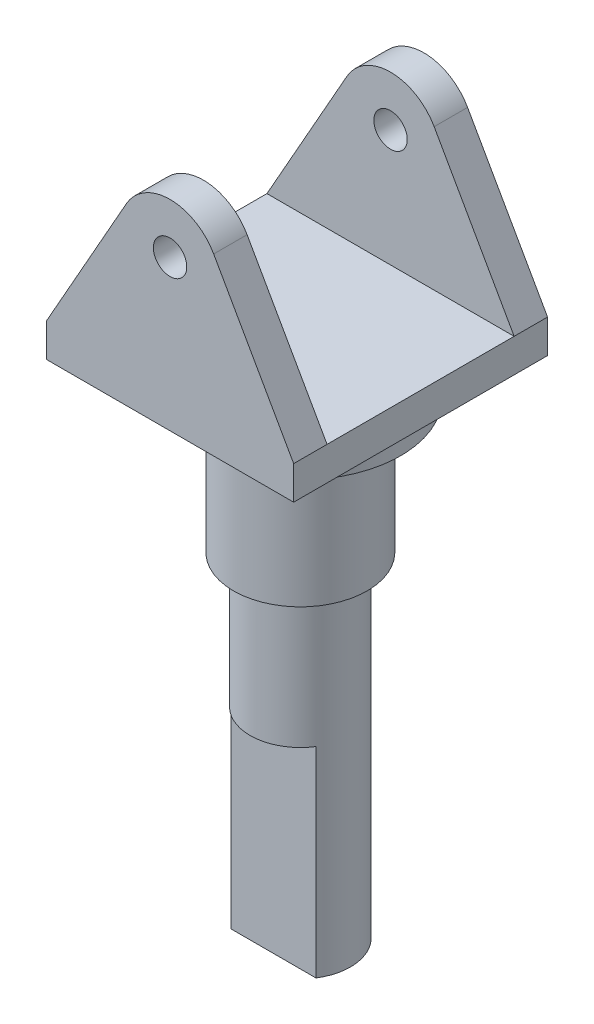
ISO-10303-21;
HEADER;
FILE_DESCRIPTION(('STEP AP214'),'2;1');
FILE_NAME('part.step','',(''),(''),'','','');
FILE_SCHEMA(('AUTOMOTIVE_DESIGN { 1 0 10303 214 1 1 1 1 }'));
ENDSEC;
DATA;
#1=APPLICATION_CONTEXT('core data for automotive mechanical design processes');
#2=APPLICATION_PROTOCOL_DEFINITION('international standard','automotive_design',2000,#1);
#3=PRODUCT_CONTEXT('',#1,'mechanical');
#4=PRODUCT('Part','Part','',(#3));
#5=PRODUCT_RELATED_PRODUCT_CATEGORY('part','',(#4));
#6=PRODUCT_DEFINITION_FORMATION('','',#4);
#7=PRODUCT_DEFINITION_CONTEXT('part definition',#1,'design');
#8=PRODUCT_DEFINITION('design','',#6,#7);
#9=PRODUCT_DEFINITION_SHAPE('','',#8);
#10=(LENGTH_UNIT() NAMED_UNIT(*) SI_UNIT(.MILLI.,.METRE.));
#11=(NAMED_UNIT(*) PLANE_ANGLE_UNIT() SI_UNIT($,.RADIAN.));
#12=(NAMED_UNIT(*) SI_UNIT($,.STERADIAN.) SOLID_ANGLE_UNIT());
#13=UNCERTAINTY_MEASURE_WITH_UNIT(LENGTH_MEASURE(1.E-05),#10,'distance_accuracy_value','');
#14=(GEOMETRIC_REPRESENTATION_CONTEXT(3) GLOBAL_UNCERTAINTY_ASSIGNED_CONTEXT((#13)) GLOBAL_UNIT_ASSIGNED_CONTEXT((#10,
#11,#12)) REPRESENTATION_CONTEXT('',''));
#15=CARTESIAN_POINT('',(0.,0.,0.));
#16=DIRECTION('',(0.,0.,1.));
#17=DIRECTION('',(1.,0.,0.));
#18=AXIS2_PLACEMENT_3D('',#15,#16,#17);
#19=CARTESIAN_POINT('',(38.,-10.,-18.));
#20=DIRECTION('',(0.,1.,0.));
#21=DIRECTION('',(0.,0.,1.));
#22=AXIS2_PLACEMENT_3D('',#19,#20,#21);
#23=PLANE('',#22);
#24=CARTESIAN_POINT('',(38.,-10.,-38.));
#25=DIRECTION('',(0.,1.,0.));
#26=DIRECTION('',(0.,0.,1.));
#27=AXIS2_PLACEMENT_3D('',#24,#25,#26);
#28=CIRCLE('',#27,20.);
#29=CARTESIAN_POINT('',(38.,-10.,-18.));
#30=VERTEX_POINT('',#29);
#31=EDGE_CURVE('E196',#30,#30,#28,.T.);
#32=ORIENTED_EDGE('',*,*,#31,.T.);
#33=EDGE_LOOP('',(#32));
#34=FACE_BOUND('',#33,.T.);
#35=DIRECTION('',(1.,0.,0.));
#36=VECTOR('',#35,1.);
#37=CARTESIAN_POINT('',(0.,-10.,-62.));
#38=LINE('',#37,#36);
#39=CARTESIAN_POINT('',(20.,-10.,-62.));
#40=VERTEX_POINT('',#39);
#41=CARTESIAN_POINT('',(56.,-10.,-62.));
#42=VERTEX_POINT('',#41);
#43=EDGE_CURVE('E174',#40,#42,#38,.T.);
#44=ORIENTED_EDGE('',*,*,#43,.T.);
#45=CARTESIAN_POINT('',(38.,-10.,-38.));
#46=DIRECTION('',(0.,1.,0.));
#47=DIRECTION('',(0.,0.,1.));
#48=AXIS2_PLACEMENT_3D('',#45,#46,#47);
#49=CIRCLE('',#48,30.);
#50=CARTESIAN_POINT('',(56.,-10.,-14.));
#51=VERTEX_POINT('',#50);
#52=EDGE_CURVE('E193',#51,#42,#49,.T.);
#53=ORIENTED_EDGE('',*,*,#52,.F.);
#54=DIRECTION('',(1.,0.,0.));
#55=VECTOR('',#54,1.);
#56=CARTESIAN_POINT('',(0.,-10.,-14.));
#57=LINE('',#56,#55);
#58=CARTESIAN_POINT('',(20.,-10.,-14.));
#59=VERTEX_POINT('',#58);
#60=EDGE_CURVE('E168',#59,#51,#57,.T.);
#61=ORIENTED_EDGE('',*,*,#60,.F.);
#62=EDGE_CURVE('E192',#40,#59,#49,.T.);
#63=ORIENTED_EDGE('',*,*,#62,.F.);
#64=EDGE_LOOP('',(#44,#53,#61,#63));
#65=FACE_BOUND('',#64,.T.);
#66=ADVANCED_FACE('F36',(#34,#65),#23,.F.);
#67=CARTESIAN_POINT('',(38.,0.,-38.));
#68=DIRECTION('',(0.,1.,0.));
#69=DIRECTION('',(0.,0.,1.));
#70=AXIS2_PLACEMENT_3D('',#67,#68,#69);
#71=CYLINDRICAL_SURFACE('',#70,30.);
#72=DIRECTION('',(0.,-1.,0.));
#73=VECTOR('',#72,1.);
#74=CARTESIAN_POINT('',(20.,0.,-62.));
#75=LINE('',#74,#73);
#76=CARTESIAN_POINT('',(20.,0.,-62.));
#77=VERTEX_POINT('',#76);
#78=EDGE_CURVE('E173',#77,#40,#75,.T.);
#79=ORIENTED_EDGE('',*,*,#78,.T.);
#80=ORIENTED_EDGE('',*,*,#62,.T.);
#81=DIRECTION('',(0.,-1.,0.));
#82=VECTOR('',#81,1.);
#83=CARTESIAN_POINT('',(20.,0.,-14.));
#84=LINE('',#83,#82);
#85=CARTESIAN_POINT('',(20.,0.,-14.));
#86=VERTEX_POINT('',#85);
#87=EDGE_CURVE('E185',#86,#59,#84,.T.);
#88=ORIENTED_EDGE('',*,*,#87,.F.);
#89=CARTESIAN_POINT('',(38.,0.,-38.));
#90=DIRECTION('',(0.,1.,0.));
#91=DIRECTION('',(0.,0.,1.));
#92=AXIS2_PLACEMENT_3D('',#89,#90,#91);
#93=CIRCLE('',#92,30.);
#94=EDGE_CURVE('E180',#77,#86,#93,.T.);
#95=ORIENTED_EDGE('',*,*,#94,.F.);
#96=EDGE_LOOP('',(#79,#80,#88,#95));
#97=FACE_BOUND('',#96,.T.);
#98=ADVANCED_FACE('F313',(#97),#71,.T.);
#99=DIRECTION('',(0.,-1.,0.));
#100=VECTOR('',#99,1.);
#101=CARTESIAN_POINT('',(56.,0.,-62.));
#102=LINE('',#101,#100);
#103=CARTESIAN_POINT('',(56.,0.,-62.));
#104=VERTEX_POINT('',#103);
#105=EDGE_CURVE('E178',#104,#42,#102,.T.);
#106=ORIENTED_EDGE('',*,*,#105,.F.);
#107=CARTESIAN_POINT('',(56.,0.,-14.));
#108=VERTEX_POINT('',#107);
#109=EDGE_CURVE('E190',#108,#104,#93,.T.);
#110=ORIENTED_EDGE('',*,*,#109,.F.);
#111=DIRECTION('',(0.,-1.,0.));
#112=VECTOR('',#111,1.);
#113=CARTESIAN_POINT('',(56.,0.,-14.));
#114=LINE('',#113,#112);
#115=EDGE_CURVE('E177',#108,#51,#114,.T.);
#116=ORIENTED_EDGE('',*,*,#115,.T.);
#117=ORIENTED_EDGE('',*,*,#52,.T.);
#118=EDGE_LOOP('',(#106,#110,#116,#117));
#119=FACE_BOUND('',#118,.T.);
#120=ADVANCED_FACE('F319',(#119),#71,.T.);
#121=CARTESIAN_POINT('',(0.,10.,-76.));
#122=DIRECTION('',(-0.870675826256482,0.491857302042566,0.));
#123=DIRECTION('',(-0.491857302042566,-0.870675826256482,0.));
#124=AXIS2_PLACEMENT_3D('',#121,#122,#123);
#125=PLANE('',#124);
#126=DIRECTION('',(0.,0.,1.));
#127=VECTOR('',#126,1.);
#128=CARTESIAN_POINT('',(23.9398626061528,52.3778595306385,-76.));
#129=LINE('',#128,#127);
#130=CARTESIAN_POINT('',(23.9398626061528,52.3778595306385,-9.99999999999999));
#131=VERTEX_POINT('',#130);
#132=CARTESIAN_POINT('',(23.9398626061528,52.3778595306385,0.));
#133=VERTEX_POINT('',#132);
#134=EDGE_CURVE('E282',#131,#133,#129,.T.);
#135=ORIENTED_EDGE('',*,*,#134,.F.);
#136=DIRECTION('',(-0.491857302042566,-0.870675826256482,0.));
#137=VECTOR('',#136,1.);
#138=CARTESIAN_POINT('',(0.,9.99999999999999,-9.99999999999999));
#139=LINE('',#138,#137);
#140=CARTESIAN_POINT('',(0.,10.,-10.));
#141=VERTEX_POINT('',#140);
#142=EDGE_CURVE('E230',#131,#141,#139,.T.);
#143=ORIENTED_EDGE('',*,*,#142,.T.);
#144=DIRECTION('',(0.,0.,1.));
#145=VECTOR('',#144,1.);
#146=CARTESIAN_POINT('',(0.,10.,-76.));
#147=LINE('',#146,#145);
#148=CARTESIAN_POINT('',(0.,10.,0.));
#149=VERTEX_POINT('',#148);
#150=EDGE_CURVE('E278',#141,#149,#147,.T.);
#151=ORIENTED_EDGE('',*,*,#150,.T.);
#152=DIRECTION('',(-0.491857302042566,-0.870675826256482,0.));
#153=VECTOR('',#152,1.);
#154=CARTESIAN_POINT('',(0.,10.,0.));
#155=LINE('',#154,#153);
#156=EDGE_CURVE('E271',#133,#149,#155,.T.);
#157=ORIENTED_EDGE('',*,*,#156,.F.);
#158=EDGE_LOOP('',(#135,#143,#151,#157));
#159=FACE_BOUND('',#158,.T.);
#160=ADVANCED_FACE('F395',(#159),#125,.T.);
#161=CARTESIAN_POINT('',(0.,10.,-76.));
#162=VERTEX_POINT('',#161);
#163=CARTESIAN_POINT('',(0.,10.,-66.));
#164=VERTEX_POINT('',#163);
#165=EDGE_CURVE('E45',#162,#164,#147,.T.);
#166=ORIENTED_EDGE('',*,*,#165,.T.);
#167=DIRECTION('',(0.491857302042566,0.870675826256482,0.));
#168=VECTOR('',#167,1.);
#169=CARTESIAN_POINT('',(0.,10.,-66.));
#170=LINE('',#169,#168);
#171=CARTESIAN_POINT('',(23.9398626061528,52.3778595306385,-66.));
#172=VERTEX_POINT('',#171);
#173=EDGE_CURVE('E221',#164,#172,#170,.T.);
#174=ORIENTED_EDGE('',*,*,#173,.T.);
#175=CARTESIAN_POINT('',(23.9398626061528,52.3778595306385,-76.));
#176=VERTEX_POINT('',#175);
#177=EDGE_CURVE('E279',#176,#172,#129,.T.);
#178=ORIENTED_EDGE('',*,*,#177,.F.);
#179=DIRECTION('',(-0.491857302042566,-0.870675826256482,0.));
#180=VECTOR('',#179,1.);
#181=CARTESIAN_POINT('',(0.,10.,-76.));
#182=LINE('',#181,#180);
#183=EDGE_CURVE('E253',#176,#162,#182,.T.);
#184=ORIENTED_EDGE('',*,*,#183,.T.);
#185=EDGE_LOOP('',(#166,#174,#178,#184));
#186=FACE_BOUND('',#185,.T.);
#187=ADVANCED_FACE('F390',(#186),#125,.T.);
#188=CARTESIAN_POINT('',(37.,45.,-76.));
#189=DIRECTION('',(0.,0.,1.));
#190=DIRECTION('',(1.,0.,0.));
#191=AXIS2_PLACEMENT_3D('',#188,#189,#190);
#192=CYLINDRICAL_SURFACE('',#191,15.);
#193=DIRECTION('',(0.,0.,1.));
#194=VECTOR('',#193,1.);
#195=CARTESIAN_POINT('',(50.0600995598342,52.3779265032405,-76.));
#196=LINE('',#195,#194);
#197=CARTESIAN_POINT('',(50.0600995598342,52.3779265032405,-9.99999999999999));
#198=VERTEX_POINT('',#197);
#199=CARTESIAN_POINT('',(50.0600995598342,52.3779265032405,0.));
#200=VERTEX_POINT('',#199);
#201=EDGE_CURVE('E286',#198,#200,#196,.T.);
#202=ORIENTED_EDGE('',*,*,#201,.F.);
#203=CARTESIAN_POINT('',(37.,45.,-9.99999999999999));
#204=DIRECTION('',(0.,0.,-1.));
#205=DIRECTION('',(0.,1.,0.));
#206=AXIS2_PLACEMENT_3D('',#203,#204,#205);
#207=CIRCLE('',#206,15.);
#208=EDGE_CURVE('E227',#198,#131,#207,.F.);
#209=ORIENTED_EDGE('',*,*,#208,.T.);
#210=ORIENTED_EDGE('',*,*,#134,.T.);
#211=CARTESIAN_POINT('',(37.,45.,0.));
#212=DIRECTION('',(0.,0.,1.));
#213=DIRECTION('',(1.,0.,0.));
#214=AXIS2_PLACEMENT_3D('',#211,#212,#213);
#215=CIRCLE('',#214,15.);
#216=EDGE_CURVE('E268',#200,#133,#215,.T.);
#217=ORIENTED_EDGE('',*,*,#216,.F.);
#218=EDGE_LOOP('',(#202,#209,#210,#217));
#219=FACE_BOUND('',#218,.T.);
#220=ADVANCED_FACE('F370',(#219),#192,.T.);
#221=ORIENTED_EDGE('',*,*,#177,.T.);
#222=CARTESIAN_POINT('',(37.,45.,-66.));
#223=DIRECTION('',(0.,0.,1.));
#224=DIRECTION('',(1.,0.,0.));
#225=AXIS2_PLACEMENT_3D('',#222,#223,#224);
#226=CIRCLE('',#225,15.);
#227=CARTESIAN_POINT('',(50.0600995598342,52.3779265032405,-66.));
#228=VERTEX_POINT('',#227);
#229=EDGE_CURVE('E218',#172,#228,#226,.F.);
#230=ORIENTED_EDGE('',*,*,#229,.T.);
#231=CARTESIAN_POINT('',(50.0600995598342,52.3779265032405,-76.));
#232=VERTEX_POINT('',#231);
#233=EDGE_CURVE('E283',#232,#228,#196,.T.);
#234=ORIENTED_EDGE('',*,*,#233,.F.);
#235=CARTESIAN_POINT('',(37.,45.,-76.));
#236=DIRECTION('',(0.,0.,1.));
#237=DIRECTION('',(1.,0.,0.));
#238=AXIS2_PLACEMENT_3D('',#235,#236,#237);
#239=CIRCLE('',#238,15.);
#240=EDGE_CURVE('E250',#232,#176,#239,.T.);
#241=ORIENTED_EDGE('',*,*,#240,.T.);
#242=EDGE_LOOP('',(#221,#230,#234,#241));
#243=FACE_BOUND('',#242,.T.);
#244=ADVANCED_FACE('F384',(#243),#192,.T.);
#245=CARTESIAN_POINT('',(74.0002866669992,10.,-76.));
#246=DIRECTION('',(0.870673303988948,0.491861766882698,0.));
#247=DIRECTION('',(-0.491861766882698,0.870673303988948,0.));
#248=AXIS2_PLACEMENT_3D('',#245,#246,#247);
#249=PLANE('',#248);
#250=DIRECTION('',(0.,0.,1.));
#251=VECTOR('',#250,1.);
#252=CARTESIAN_POINT('',(74.0002866669992,10.,-76.));
#253=LINE('',#252,#251);
#254=CARTESIAN_POINT('',(74.0002866669992,10.,-10.));
#255=VERTEX_POINT('',#254);
#256=CARTESIAN_POINT('',(74.0002866669992,10.,0.));
#257=VERTEX_POINT('',#256);
#258=EDGE_CURVE('E291',#255,#257,#253,.T.);
#259=ORIENTED_EDGE('',*,*,#258,.F.);
#260=DIRECTION('',(-0.491861766882698,0.870673303988948,0.));
#261=VECTOR('',#260,1.);
#262=CARTESIAN_POINT('',(74.0002866669992,9.99999999999999,-9.99999999999999));
#263=LINE('',#262,#261);
#264=EDGE_CURVE('E224',#255,#198,#263,.T.);
#265=ORIENTED_EDGE('',*,*,#264,.T.);
#266=ORIENTED_EDGE('',*,*,#201,.T.);
#267=DIRECTION('',(-0.491861766882698,0.870673303988948,0.));
#268=VECTOR('',#267,1.);
#269=CARTESIAN_POINT('',(74.0002866669992,10.,0.));
#270=LINE('',#269,#268);
#271=EDGE_CURVE('E265',#257,#200,#270,.T.);
#272=ORIENTED_EDGE('',*,*,#271,.F.);
#273=EDGE_LOOP('',(#259,#265,#266,#272));
#274=FACE_BOUND('',#273,.T.);
#275=ADVANCED_FACE('F366',(#274),#249,.T.);
#276=ORIENTED_EDGE('',*,*,#233,.T.);
#277=DIRECTION('',(0.491861766882698,-0.870673303988948,0.));
#278=VECTOR('',#277,1.);
#279=CARTESIAN_POINT('',(74.0002866669992,10.,-66.));
#280=LINE('',#279,#278);
#281=CARTESIAN_POINT('',(74.0002866669992,10.,-66.));
#282=VERTEX_POINT('',#281);
#283=EDGE_CURVE('E215',#228,#282,#280,.T.);
#284=ORIENTED_EDGE('',*,*,#283,.T.);
#285=CARTESIAN_POINT('',(74.0002866669992,10.,-76.));
#286=VERTEX_POINT('',#285);
#287=EDGE_CURVE('E287',#286,#282,#253,.T.);
#288=ORIENTED_EDGE('',*,*,#287,.F.);
#289=DIRECTION('',(-0.491861766882698,0.870673303988948,0.));
#290=VECTOR('',#289,1.);
#291=CARTESIAN_POINT('',(74.0002866669992,10.,-76.));
#292=LINE('',#291,#290);
#293=EDGE_CURVE('E247',#286,#232,#292,.T.);
#294=ORIENTED_EDGE('',*,*,#293,.T.);
#295=EDGE_LOOP('',(#276,#284,#288,#294));
#296=FACE_BOUND('',#295,.T.);
#297=ADVANCED_FACE('F307',(#296),#249,.T.);
#298=CARTESIAN_POINT('',(37.,45.,-76.));
#299=DIRECTION('',(0.,0.,1.));
#300=DIRECTION('',(1.,0.,0.));
#301=AXIS2_PLACEMENT_3D('',#298,#299,#300);
#302=CYLINDRICAL_SURFACE('',#301,5.00000000000001);
#303=CARTESIAN_POINT('',(37.,45.,0.));
#304=DIRECTION('',(0.,0.,1.));
#305=DIRECTION('',(1.,0.,0.));
#306=AXIS2_PLACEMENT_3D('',#303,#304,#305);
#307=CIRCLE('',#306,5.00000000000001);
#308=CARTESIAN_POINT('',(42.,45.,0.));
#309=VERTEX_POINT('',#308);
#310=EDGE_CURVE('E233',#309,#309,#307,.T.);
#311=ORIENTED_EDGE('',*,*,#310,.T.);
#312=EDGE_LOOP('',(#311));
#313=FACE_BOUND('',#312,.T.);
#314=CARTESIAN_POINT('',(37.,45.,-9.99999999999999));
#315=DIRECTION('',(0.,0.,-1.));
#316=DIRECTION('',(0.,1.,0.));
#317=AXIS2_PLACEMENT_3D('',#314,#315,#316);
#318=CIRCLE('',#317,5.00000000000001);
#319=CARTESIAN_POINT('',(37.,50.,-9.99999999999999));
#320=VERTEX_POINT('',#319);
#321=EDGE_CURVE('E40',#320,#320,#318,.F.);
#322=ORIENTED_EDGE('',*,*,#321,.F.);
#323=EDGE_LOOP('',(#322));
#324=FACE_BOUND('',#323,.T.);
#325=ADVANCED_FACE('F299',(#313,#324),#302,.F.);
#326=CARTESIAN_POINT('',(37.,45.,-76.));
#327=DIRECTION('',(0.,0.,1.));
#328=DIRECTION('',(1.,0.,0.));
#329=AXIS2_PLACEMENT_3D('',#326,#327,#328);
#330=CIRCLE('',#329,5.00000000000001);
#331=CARTESIAN_POINT('',(42.,45.,-76.));
#332=VERTEX_POINT('',#331);
#333=EDGE_CURVE('E234',#332,#332,#330,.T.);
#334=ORIENTED_EDGE('',*,*,#333,.F.);
#335=EDGE_LOOP('',(#334));
#336=FACE_BOUND('',#335,.T.);
#337=CARTESIAN_POINT('',(37.,45.,-66.));
#338=DIRECTION('',(0.,0.,1.));
#339=DIRECTION('',(1.,0.,0.));
#340=AXIS2_PLACEMENT_3D('',#337,#338,#339);
#341=CIRCLE('',#340,5.00000000000001);
#342=CARTESIAN_POINT('',(42.,45.,-66.));
#343=VERTEX_POINT('',#342);
#344=EDGE_CURVE('E214',#343,#343,#341,.F.);
#345=ORIENTED_EDGE('',*,*,#344,.F.);
#346=EDGE_LOOP('',(#345));
#347=FACE_BOUND('',#346,.T.);
#348=ADVANCED_FACE('F297',(#336,#347),#302,.F.);
#349=CARTESIAN_POINT('',(0.,0.,-76.));
#350=DIRECTION('',(0.,-1.,0.));
#351=DIRECTION('',(0.,0.,-1.));
#352=AXIS2_PLACEMENT_3D('',#349,#350,#351);
#353=PLANE('',#352);
#354=ORIENTED_EDGE('',*,*,#109,.T.);
#355=DIRECTION('',(1.,0.,0.));
#356=VECTOR('',#355,1.);
#357=CARTESIAN_POINT('',(0.,0.,-62.));
#358=LINE('',#357,#356);
#359=EDGE_CURVE('E60',#77,#104,#358,.T.);
#360=ORIENTED_EDGE('',*,*,#359,.F.);
#361=ORIENTED_EDGE('',*,*,#94,.T.);
#362=DIRECTION('',(1.,0.,0.));
#363=VECTOR('',#362,1.);
#364=CARTESIAN_POINT('',(0.,0.,-14.));
#365=LINE('',#364,#363);
#366=EDGE_CURVE('E183',#86,#108,#365,.T.);
#367=ORIENTED_EDGE('',*,*,#366,.T.);
#368=EDGE_LOOP('',(#354,#360,#361,#367));
#369=FACE_BOUND('',#368,.T.);
#370=DIRECTION('',(1.,0.,0.));
#371=VECTOR('',#370,1.);
#372=CARTESIAN_POINT('',(0.,0.,0.));
#373=LINE('',#372,#371);
#374=CARTESIAN_POINT('',(0.,0.,0.));
#375=VERTEX_POINT('',#374);
#376=CARTESIAN_POINT('',(74.0002866669992,0.,0.));
#377=VERTEX_POINT('',#376);
#378=EDGE_CURVE('E237',#375,#377,#373,.T.);
#379=ORIENTED_EDGE('',*,*,#378,.F.);
#380=DIRECTION('',(0.,0.,1.));
#381=VECTOR('',#380,1.);
#382=CARTESIAN_POINT('',(0.,0.,-76.));
#383=LINE('',#382,#381);
#384=CARTESIAN_POINT('',(0.,0.,-76.));
#385=VERTEX_POINT('',#384);
#386=EDGE_CURVE('E11',#385,#375,#383,.T.);
#387=ORIENTED_EDGE('',*,*,#386,.F.);
#388=DIRECTION('',(1.,0.,0.));
#389=VECTOR('',#388,1.);
#390=CARTESIAN_POINT('',(0.,0.,-76.));
#391=LINE('',#390,#389);
#392=CARTESIAN_POINT('',(74.0002866669992,0.,-76.));
#393=VERTEX_POINT('',#392);
#394=EDGE_CURVE('E240',#385,#393,#391,.T.);
#395=ORIENTED_EDGE('',*,*,#394,.T.);
#396=DIRECTION('',(0.,0.,1.));
#397=VECTOR('',#396,1.);
#398=CARTESIAN_POINT('',(74.0002866669992,0.,-76.));
#399=LINE('',#398,#397);
#400=EDGE_CURVE('E259',#393,#377,#399,.T.);
#401=ORIENTED_EDGE('',*,*,#400,.T.);
#402=EDGE_LOOP('',(#379,#387,#395,#401));
#403=FACE_BOUND('',#402,.T.);
#404=ADVANCED_FACE('F38',(#369,#403),#353,.T.);
#405=CARTESIAN_POINT('',(0.,0.,-76.));
#406=DIRECTION('',(-1.,0.,0.));
#407=DIRECTION('',(0.,0.,1.));
#408=AXIS2_PLACEMENT_3D('',#405,#406,#407);
#409=PLANE('',#408);
#410=DIRECTION('',(0.,-1.,0.));
#411=VECTOR('',#410,1.);
#412=CARTESIAN_POINT('',(0.,0.,0.));
#413=LINE('',#412,#411);
#414=EDGE_CURVE('E244',#149,#375,#413,.T.);
#415=ORIENTED_EDGE('',*,*,#414,.F.);
#416=ORIENTED_EDGE('',*,*,#150,.F.);
#417=DIRECTION('',(0.,0.,-1.));
#418=VECTOR('',#417,1.);
#419=CARTESIAN_POINT('',(0.,10.,-10.));
#420=LINE('',#419,#418);
#421=EDGE_CURVE('E206',#141,#164,#420,.T.);
#422=ORIENTED_EDGE('',*,*,#421,.T.);
#423=ORIENTED_EDGE('',*,*,#165,.F.);
#424=DIRECTION('',(0.,-1.,0.));
#425=VECTOR('',#424,1.);
#426=CARTESIAN_POINT('',(0.,0.,-76.));
#427=LINE('',#426,#425);
#428=EDGE_CURVE('E256',#162,#385,#427,.T.);
#429=ORIENTED_EDGE('',*,*,#428,.T.);
#430=ORIENTED_EDGE('',*,*,#386,.T.);
#431=EDGE_LOOP('',(#415,#416,#422,#423,#429,#430));
#432=FACE_BOUND('',#431,.T.);
#433=ADVANCED_FACE('F306',(#432),#409,.T.);
#434=CARTESIAN_POINT('',(74.0002866669992,0.,-76.));
#435=DIRECTION('',(1.,0.,0.));
#436=DIRECTION('',(0.,0.,-1.));
#437=AXIS2_PLACEMENT_3D('',#434,#435,#436);
#438=PLANE('',#437);
#439=DIRECTION('',(0.,1.,0.));
#440=VECTOR('',#439,1.);
#441=CARTESIAN_POINT('',(74.0002866669992,0.,0.));
#442=LINE('',#441,#440);
#443=EDGE_CURVE('E262',#377,#257,#442,.T.);
#444=ORIENTED_EDGE('',*,*,#443,.F.);
#445=ORIENTED_EDGE('',*,*,#400,.F.);
#446=DIRECTION('',(0.,1.,0.));
#447=VECTOR('',#446,1.);
#448=CARTESIAN_POINT('',(74.0002866669992,0.,-76.));
#449=LINE('',#448,#447);
#450=EDGE_CURVE('E243',#393,#286,#449,.T.);
#451=ORIENTED_EDGE('',*,*,#450,.T.);
#452=ORIENTED_EDGE('',*,*,#287,.T.);
#453=EDGE_CURVE('E290',#282,#255,#253,.T.);
#454=ORIENTED_EDGE('',*,*,#453,.T.);
#455=ORIENTED_EDGE('',*,*,#258,.T.);
#456=EDGE_LOOP('',(#444,#445,#451,#452,#454,#455));
#457=FACE_BOUND('',#456,.T.);
#458=ADVANCED_FACE('F376',(#457),#438,.T.);
#459=CARTESIAN_POINT('',(37.,45.,-76.));
#460=DIRECTION('',(0.,0.,1.));
#461=DIRECTION('',(1.,0.,0.));
#462=AXIS2_PLACEMENT_3D('',#459,#460,#461);
#463=PLANE('',#462);
#464=ORIENTED_EDGE('',*,*,#333,.T.);
#465=EDGE_LOOP('',(#464));
#466=FACE_BOUND('',#465,.T.);
#467=ORIENTED_EDGE('',*,*,#394,.F.);
#468=ORIENTED_EDGE('',*,*,#428,.F.);
#469=ORIENTED_EDGE('',*,*,#183,.F.);
#470=ORIENTED_EDGE('',*,*,#240,.F.);
#471=ORIENTED_EDGE('',*,*,#293,.F.);
#472=ORIENTED_EDGE('',*,*,#450,.F.);
#473=EDGE_LOOP('',(#467,#468,#469,#470,#471,#472));
#474=FACE_BOUND('',#473,.T.);
#475=ADVANCED_FACE('F353',(#466,#474),#463,.F.);
#476=CARTESIAN_POINT('',(37.,45.,0.));
#477=DIRECTION('',(0.,0.,1.));
#478=DIRECTION('',(1.,0.,0.));
#479=AXIS2_PLACEMENT_3D('',#476,#477,#478);
#480=PLANE('',#479);
#481=ORIENTED_EDGE('',*,*,#310,.F.);
#482=EDGE_LOOP('',(#481));
#483=FACE_BOUND('',#482,.T.);
#484=ORIENTED_EDGE('',*,*,#378,.T.);
#485=ORIENTED_EDGE('',*,*,#443,.T.);
#486=ORIENTED_EDGE('',*,*,#271,.T.);
#487=ORIENTED_EDGE('',*,*,#216,.T.);
#488=ORIENTED_EDGE('',*,*,#156,.T.);
#489=ORIENTED_EDGE('',*,*,#414,.T.);
#490=EDGE_LOOP('',(#484,#485,#486,#487,#488,#489));
#491=FACE_BOUND('',#490,.T.);
#492=ADVANCED_FACE('F348',(#483,#491),#480,.T.);
#493=CARTESIAN_POINT('',(128.,61.0486599011187,-9.99999999999999));
#494=DIRECTION('',(0.,0.,-1.));
#495=DIRECTION('',(0.,1.,0.));
#496=AXIS2_PLACEMENT_3D('',#493,#494,#495);
#497=PLANE('',#496);
#498=ORIENTED_EDGE('',*,*,#208,.F.);
#499=ORIENTED_EDGE('',*,*,#264,.F.);
#500=DIRECTION('',(-1.,0.,0.));
#501=VECTOR('',#500,1.);
#502=CARTESIAN_POINT('',(128.,10.,-10.));
#503=LINE('',#502,#501);
#504=EDGE_CURVE('E212',#255,#141,#503,.T.);
#505=ORIENTED_EDGE('',*,*,#504,.T.);
#506=ORIENTED_EDGE('',*,*,#142,.F.);
#507=EDGE_LOOP('',(#498,#499,#505,#506));
#508=FACE_BOUND('',#507,.T.);
#509=ORIENTED_EDGE('',*,*,#321,.T.);
#510=EDGE_LOOP('',(#509));
#511=FACE_BOUND('',#510,.T.);
#512=ADVANCED_FACE('F343',(#508,#511),#497,.T.);
#513=CARTESIAN_POINT('',(128.,10.,-66.));
#514=DIRECTION('',(0.,0.,1.));
#515=DIRECTION('',(1.,0.,0.));
#516=AXIS2_PLACEMENT_3D('',#513,#514,#515);
#517=PLANE('',#516);
#518=DIRECTION('',(-1.,0.,0.));
#519=VECTOR('',#518,1.);
#520=CARTESIAN_POINT('',(128.,10.,-66.));
#521=LINE('',#520,#519);
#522=EDGE_CURVE('E209',#282,#164,#521,.T.);
#523=ORIENTED_EDGE('',*,*,#522,.F.);
#524=ORIENTED_EDGE('',*,*,#283,.F.);
#525=ORIENTED_EDGE('',*,*,#229,.F.);
#526=ORIENTED_EDGE('',*,*,#173,.F.);
#527=EDGE_LOOP('',(#523,#524,#525,#526));
#528=FACE_BOUND('',#527,.T.);
#529=ORIENTED_EDGE('',*,*,#344,.T.);
#530=EDGE_LOOP('',(#529));
#531=FACE_BOUND('',#530,.T.);
#532=ADVANCED_FACE('F295',(#528,#531),#517,.T.);
#533=CARTESIAN_POINT('',(128.,10.,-10.));
#534=DIRECTION('',(0.,1.,0.));
#535=DIRECTION('',(0.,0.,1.));
#536=AXIS2_PLACEMENT_3D('',#533,#534,#535);
#537=PLANE('',#536);
#538=ORIENTED_EDGE('',*,*,#522,.T.);
#539=ORIENTED_EDGE('',*,*,#421,.F.);
#540=ORIENTED_EDGE('',*,*,#504,.F.);
#541=ORIENTED_EDGE('',*,*,#453,.F.);
#542=EDGE_LOOP('',(#538,#539,#540,#541));
#543=FACE_BOUND('',#542,.T.);
#544=ADVANCED_FACE('F339',(#543),#537,.T.);
#545=CARTESIAN_POINT('',(38.,-150.,-23.));
#546=DIRECTION('',(0.,1.,0.));
#547=DIRECTION('',(0.,0.,1.));
#548=AXIS2_PLACEMENT_3D('',#545,#546,#547);
#549=PLANE('',#548);
#550=CARTESIAN_POINT('',(38.,-150.,-38.));
#551=DIRECTION('',(0.,1.,0.));
#552=DIRECTION('',(0.,0.,1.));
#553=AXIS2_PLACEMENT_3D('',#550,#551,#552);
#554=CIRCLE('',#553,15.);
#555=CARTESIAN_POINT('',(50.6885775404495,-150.,-30.));
#556=VERTEX_POINT('',#555);
#557=CARTESIAN_POINT('',(25.3114224595505,-150.,-30.));
#558=VERTEX_POINT('',#557);
#559=EDGE_CURVE('E166',#556,#558,#554,.T.);
#560=ORIENTED_EDGE('',*,*,#559,.F.);
#561=DIRECTION('',(1.,0.,0.));
#562=VECTOR('',#561,1.);
#563=CARTESIAN_POINT('',(0.,-150.,-30.));
#564=LINE('',#563,#562);
#565=EDGE_CURVE('E154',#558,#556,#564,.T.);
#566=ORIENTED_EDGE('',*,*,#565,.F.);
#567=EDGE_LOOP('',(#560,#566));
#568=FACE_BOUND('',#567,.T.);
#569=ADVANCED_FACE('F336',(#568),#549,.F.);
#570=CARTESIAN_POINT('',(38.,0.,-38.));
#571=DIRECTION('',(0.,1.,0.));
#572=DIRECTION('',(0.,0.,1.));
#573=AXIS2_PLACEMENT_3D('',#570,#571,#572);
#574=CYLINDRICAL_SURFACE('',#573,15.);
#575=ORIENTED_EDGE('',*,*,#559,.T.);
#576=DIRECTION('',(0.,-1.,0.));
#577=VECTOR('',#576,1.);
#578=CARTESIAN_POINT('',(25.3114224595505,-90.,-30.));
#579=LINE('',#578,#577);
#580=CARTESIAN_POINT('',(25.3114224595505,-90.,-30.));
#581=VERTEX_POINT('',#580);
#582=EDGE_CURVE('E158',#581,#558,#579,.T.);
#583=ORIENTED_EDGE('',*,*,#582,.F.);
#584=CARTESIAN_POINT('',(38.,-90.,-38.));
#585=DIRECTION('',(0.,-1.,0.));
#586=DIRECTION('',(0.,0.,-1.));
#587=AXIS2_PLACEMENT_3D('',#584,#585,#586);
#588=CIRCLE('',#587,15.);
#589=CARTESIAN_POINT('',(50.6885775404495,-90.,-30.));
#590=VERTEX_POINT('',#589);
#591=EDGE_CURVE('E149',#590,#581,#588,.T.);
#592=ORIENTED_EDGE('',*,*,#591,.F.);
#593=DIRECTION('',(0.,-1.,0.));
#594=VECTOR('',#593,1.);
#595=CARTESIAN_POINT('',(50.6885775404495,-90.,-30.));
#596=LINE('',#595,#594);
#597=EDGE_CURVE('E160',#590,#556,#596,.T.);
#598=ORIENTED_EDGE('',*,*,#597,.T.);
#599=EDGE_LOOP('',(#575,#583,#592,#598));
#600=FACE_BOUND('',#599,.T.);
#601=CARTESIAN_POINT('',(38.,-50.,-38.));
#602=DIRECTION('',(0.,1.,0.));
#603=DIRECTION('',(0.,0.,1.));
#604=AXIS2_PLACEMENT_3D('',#601,#602,#603);
#605=CIRCLE('',#604,15.);
#606=CARTESIAN_POINT('',(38.,-50.,-23.));
#607=VERTEX_POINT('',#606);
#608=EDGE_CURVE('E202',#607,#607,#605,.T.);
#609=ORIENTED_EDGE('',*,*,#608,.F.);
#610=EDGE_LOOP('',(#609));
#611=FACE_BOUND('',#610,.T.);
#612=ADVANCED_FACE('F163',(#600,#611),#574,.T.);
#613=CARTESIAN_POINT('',(38.,-50.,-23.));
#614=DIRECTION('',(0.,1.,0.));
#615=DIRECTION('',(0.,0.,1.));
#616=AXIS2_PLACEMENT_3D('',#613,#614,#615);
#617=PLANE('',#616);
#618=CARTESIAN_POINT('',(38.,-50.,-38.));
#619=DIRECTION('',(0.,1.,0.));
#620=DIRECTION('',(0.,0.,1.));
#621=AXIS2_PLACEMENT_3D('',#618,#619,#620);
#622=CIRCLE('',#621,20.);
#623=CARTESIAN_POINT('',(38.,-50.,-18.));
#624=VERTEX_POINT('',#623);
#625=EDGE_CURVE('E199',#624,#624,#622,.T.);
#626=ORIENTED_EDGE('',*,*,#625,.F.);
#627=EDGE_LOOP('',(#626));
#628=FACE_BOUND('',#627,.T.);
#629=ORIENTED_EDGE('',*,*,#608,.T.);
#630=EDGE_LOOP('',(#629));
#631=FACE_BOUND('',#630,.T.);
#632=ADVANCED_FACE('F329',(#628,#631),#617,.F.);
#633=CARTESIAN_POINT('',(38.,0.,-38.));
#634=DIRECTION('',(0.,1.,0.));
#635=DIRECTION('',(0.,0.,1.));
#636=AXIS2_PLACEMENT_3D('',#633,#634,#635);
#637=CYLINDRICAL_SURFACE('',#636,20.);
#638=ORIENTED_EDGE('',*,*,#31,.F.);
#639=EDGE_LOOP('',(#638));
#640=FACE_BOUND('',#639,.T.);
#641=ORIENTED_EDGE('',*,*,#625,.T.);
#642=EDGE_LOOP('',(#641));
#643=FACE_BOUND('',#642,.T.);
#644=ADVANCED_FACE('F325',(#640,#643),#637,.T.);
#645=CARTESIAN_POINT('',(0.,0.,-14.));
#646=DIRECTION('',(0.,0.,-1.));
#647=DIRECTION('',(-1.,0.,0.));
#648=AXIS2_PLACEMENT_3D('',#645,#646,#647);
#649=PLANE('',#648);
#650=ORIENTED_EDGE('',*,*,#60,.T.);
#651=ORIENTED_EDGE('',*,*,#115,.F.);
#652=ORIENTED_EDGE('',*,*,#366,.F.);
#653=ORIENTED_EDGE('',*,*,#87,.T.);
#654=EDGE_LOOP('',(#650,#651,#652,#653));
#655=FACE_BOUND('',#654,.T.);
#656=ADVANCED_FACE('F328',(#655),#649,.F.);
#657=CARTESIAN_POINT('',(0.,0.,-62.));
#658=DIRECTION('',(0.,0.,-1.));
#659=DIRECTION('',(-1.,0.,0.));
#660=AXIS2_PLACEMENT_3D('',#657,#658,#659);
#661=PLANE('',#660);
#662=ORIENTED_EDGE('',*,*,#43,.F.);
#663=ORIENTED_EDGE('',*,*,#78,.F.);
#664=ORIENTED_EDGE('',*,*,#359,.T.);
#665=ORIENTED_EDGE('',*,*,#105,.T.);
#666=EDGE_LOOP('',(#662,#663,#664,#665));
#667=FACE_BOUND('',#666,.T.);
#668=ADVANCED_FACE('F436',(#667),#661,.T.);
#669=CARTESIAN_POINT('',(0.,-90.,-30.));
#670=DIRECTION('',(0.,0.,-1.));
#671=DIRECTION('',(-1.,0.,0.));
#672=AXIS2_PLACEMENT_3D('',#669,#670,#671);
#673=PLANE('',#672);
#674=ORIENTED_EDGE('',*,*,#565,.T.);
#675=ORIENTED_EDGE('',*,*,#597,.F.);
#676=DIRECTION('',(1.,0.,0.));
#677=VECTOR('',#676,1.);
#678=CARTESIAN_POINT('',(0.,-90.,-30.));
#679=LINE('',#678,#677);
#680=EDGE_CURVE('E52',#581,#590,#679,.T.);
#681=ORIENTED_EDGE('',*,*,#680,.F.);
#682=ORIENTED_EDGE('',*,*,#582,.T.);
#683=EDGE_LOOP('',(#674,#675,#681,#682));
#684=FACE_BOUND('',#683,.T.);
#685=ADVANCED_FACE('F157',(#684),#673,.F.);
#686=CARTESIAN_POINT('',(0.,-90.,0.));
#687=DIRECTION('',(0.,-1.,0.));
#688=DIRECTION('',(0.,0.,-1.));
#689=AXIS2_PLACEMENT_3D('',#686,#687,#688);
#690=PLANE('',#689);
#691=ORIENTED_EDGE('',*,*,#591,.T.);
#692=ORIENTED_EDGE('',*,*,#680,.T.);
#693=EDGE_LOOP('',(#691,#692));
#694=FACE_BOUND('',#693,.T.);
#695=ADVANCED_FACE('F150',(#694),#690,.T.);
#696=CLOSED_SHELL('',(#66,#98,#120,#160,#187,#220,#244,#275,#297,#325,#348,#404,#433,#458,#475,
#492,#512,#532,#544,#569,#612,#632,#644,#656,#668,#685,#695));
#697=MANIFOLD_SOLID_BREP('B2',#696);
#698=ADVANCED_BREP_SHAPE_REPRESENTATION('',(#18,#697),#14);
#699=SHAPE_DEFINITION_REPRESENTATION(#9,#698);
ENDSEC;
END-ISO-10303-21;
